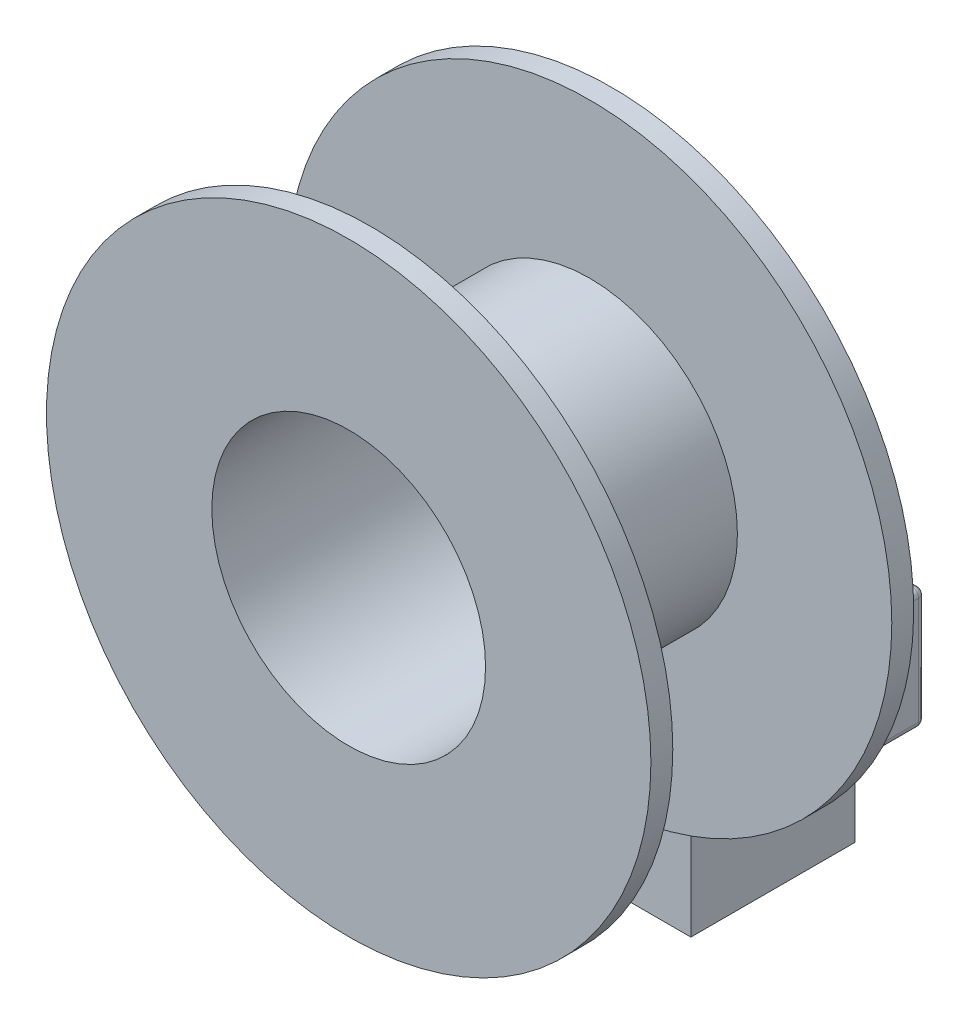
ISO-10303-21;
HEADER;
FILE_DESCRIPTION(('STEP AP214'),'2;1');
FILE_NAME('part.step','',(''),(''),'','','');
FILE_SCHEMA(('AUTOMOTIVE_DESIGN { 1 0 10303 214 1 1 1 1 }'));
ENDSEC;
DATA;
#1=APPLICATION_CONTEXT('core data for automotive mechanical design processes');
#2=APPLICATION_PROTOCOL_DEFINITION('international standard','automotive_design',2000,#1);
#3=PRODUCT_CONTEXT('',#1,'mechanical');
#4=PRODUCT('Part','Part','',(#3));
#5=PRODUCT_RELATED_PRODUCT_CATEGORY('part','',(#4));
#6=PRODUCT_DEFINITION_FORMATION('','',#4);
#7=PRODUCT_DEFINITION_CONTEXT('part definition',#1,'design');
#8=PRODUCT_DEFINITION('design','',#6,#7);
#9=PRODUCT_DEFINITION_SHAPE('','',#8);
#10=(LENGTH_UNIT() NAMED_UNIT(*) SI_UNIT(.MILLI.,.METRE.));
#11=(NAMED_UNIT(*) PLANE_ANGLE_UNIT() SI_UNIT($,.RADIAN.));
#12=(NAMED_UNIT(*) SI_UNIT($,.STERADIAN.) SOLID_ANGLE_UNIT());
#13=UNCERTAINTY_MEASURE_WITH_UNIT(LENGTH_MEASURE(1.E-05),#10,'distance_accuracy_value','');
#14=(GEOMETRIC_REPRESENTATION_CONTEXT(3) GLOBAL_UNCERTAINTY_ASSIGNED_CONTEXT((#13)) GLOBAL_UNIT_ASSIGNED_CONTEXT((#10,
#11,#12)) REPRESENTATION_CONTEXT('',''));
#15=CARTESIAN_POINT('',(0.,0.,0.));
#16=DIRECTION('',(0.,0.,1.));
#17=DIRECTION('',(1.,0.,0.));
#18=AXIS2_PLACEMENT_3D('',#15,#16,#17);
#19=CARTESIAN_POINT('',(0.,0.,1.));
#20=DIRECTION('',(0.,0.,1.));
#21=DIRECTION('',(1.,0.,0.));
#22=AXIS2_PLACEMENT_3D('',#19,#20,#21);
#23=PLANE('',#22);
#24=CARTESIAN_POINT('',(0.,0.,1.));
#25=DIRECTION('',(0.,0.,1.));
#26=DIRECTION('',(1.,0.,0.));
#27=AXIS2_PLACEMENT_3D('',#24,#25,#26);
#28=CIRCLE('',#27,13.8);
#29=CARTESIAN_POINT('',(13.8,0.,1.));
#30=VERTEX_POINT('',#29);
#31=EDGE_CURVE('E200',#30,#30,#28,.T.);
#32=ORIENTED_EDGE('',*,*,#31,.T.);
#33=EDGE_LOOP('',(#32));
#34=FACE_BOUND('',#33,.T.);
#35=CARTESIAN_POINT('',(0.,0.,1.));
#36=DIRECTION('',(0.,0.,1.));
#37=DIRECTION('',(1.,0.,0.));
#38=AXIS2_PLACEMENT_3D('',#35,#36,#37);
#39=CIRCLE('',#38,6.75);
#40=CARTESIAN_POINT('',(6.75,0.,1.));
#41=VERTEX_POINT('',#40);
#42=EDGE_CURVE('E188',#41,#41,#39,.T.);
#43=ORIENTED_EDGE('',*,*,#42,.F.);
#44=EDGE_LOOP('',(#43));
#45=FACE_BOUND('',#44,.T.);
#46=ADVANCED_FACE('F36',(#34,#45),#23,.T.);
#47=CARTESIAN_POINT('',(0.,0.,0.));
#48=DIRECTION('',(0.,0.,1.));
#49=DIRECTION('',(1.,0.,0.));
#50=AXIS2_PLACEMENT_3D('',#47,#48,#49);
#51=PLANE('',#50);
#52=CARTESIAN_POINT('',(0.,0.,0.));
#53=DIRECTION('',(0.,0.,1.));
#54=DIRECTION('',(1.,0.,0.));
#55=AXIS2_PLACEMENT_3D('',#52,#53,#54);
#56=CIRCLE('',#55,13.8);
#57=CARTESIAN_POINT('',(4.125,-13.1690688736904,0.));
#58=VERTEX_POINT('',#57);
#59=CARTESIAN_POINT('',(-4.125,-13.1690688736904,0.));
#60=VERTEX_POINT('',#59);
#61=EDGE_CURVE('E199',#58,#60,#56,.T.);
#62=ORIENTED_EDGE('',*,*,#61,.F.);
#63=DIRECTION('',(0.,1.,0.));
#64=VECTOR('',#63,1.);
#65=CARTESIAN_POINT('',(4.125,0.,0.));
#66=LINE('',#65,#64);
#67=CARTESIAN_POINT('',(4.125,-9.3,0.));
#68=VERTEX_POINT('',#67);
#69=EDGE_CURVE('E178',#58,#68,#66,.T.);
#70=ORIENTED_EDGE('',*,*,#69,.T.);
#71=CARTESIAN_POINT('',(3.825,-9.3,0.));
#72=DIRECTION('',(0.,0.,1.));
#73=DIRECTION('',(1.,0.,0.));
#74=AXIS2_PLACEMENT_3D('',#71,#72,#73);
#75=CIRCLE('',#74,0.3);
#76=CARTESIAN_POINT('',(3.825,-9.,0.));
#77=VERTEX_POINT('',#76);
#78=EDGE_CURVE('E11',#68,#77,#75,.T.);
#79=ORIENTED_EDGE('',*,*,#78,.T.);
#80=DIRECTION('',(-1.,0.,0.));
#81=VECTOR('',#80,1.);
#82=CARTESIAN_POINT('',(0.,-9.,0.));
#83=LINE('',#82,#81);
#84=CARTESIAN_POINT('',(-3.825,-9.,0.));
#85=VERTEX_POINT('',#84);
#86=EDGE_CURVE('E212',#77,#85,#83,.T.);
#87=ORIENTED_EDGE('',*,*,#86,.T.);
#88=CARTESIAN_POINT('',(-3.825,-9.3,0.));
#89=DIRECTION('',(0.,0.,1.));
#90=DIRECTION('',(1.,0.,0.));
#91=AXIS2_PLACEMENT_3D('',#88,#89,#90);
#92=CIRCLE('',#91,0.3);
#93=CARTESIAN_POINT('',(-4.125,-9.3,0.));
#94=VERTEX_POINT('',#93);
#95=EDGE_CURVE('E247',#85,#94,#92,.T.);
#96=ORIENTED_EDGE('',*,*,#95,.T.);
#97=DIRECTION('',(0.,-1.,0.));
#98=VECTOR('',#97,1.);
#99=CARTESIAN_POINT('',(-4.125,0.,0.));
#100=LINE('',#99,#98);
#101=EDGE_CURVE('E175',#94,#60,#100,.T.);
#102=ORIENTED_EDGE('',*,*,#101,.T.);
#103=EDGE_LOOP('',(#62,#70,#79,#87,#96,#102));
#104=FACE_BOUND('',#103,.T.);
#105=CARTESIAN_POINT('',(0.,0.,0.));
#106=DIRECTION('',(0.,0.,1.));
#107=DIRECTION('',(1.,0.,0.));
#108=AXIS2_PLACEMENT_3D('',#105,#106,#107);
#109=CIRCLE('',#108,6.25);
#110=CARTESIAN_POINT('',(6.25,0.,0.));
#111=VERTEX_POINT('',#110);
#112=EDGE_CURVE('E194',#111,#111,#109,.T.);
#113=ORIENTED_EDGE('',*,*,#112,.T.);
#114=EDGE_LOOP('',(#113));
#115=FACE_BOUND('',#114,.T.);
#116=ADVANCED_FACE('F325',(#104,#115),#51,.F.);
#117=CARTESIAN_POINT('',(0.,0.,1.));
#118=DIRECTION('',(0.,0.,-1.));
#119=DIRECTION('',(-1.,0.,0.));
#120=AXIS2_PLACEMENT_3D('',#117,#118,#119);
#121=CYLINDRICAL_SURFACE('',#120,13.8);
#122=ORIENTED_EDGE('',*,*,#31,.F.);
#123=EDGE_LOOP('',(#122));
#124=FACE_BOUND('',#123,.T.);
#125=CARTESIAN_POINT('',(0.,0.,0.5));
#126=DIRECTION('',(0.,0.,-1.));
#127=DIRECTION('',(-1.,0.,0.));
#128=AXIS2_PLACEMENT_3D('',#125,#126,#127);
#129=CIRCLE('',#128,13.8);
#130=CARTESIAN_POINT('',(4.125,-13.1690688736904,0.5));
#131=VERTEX_POINT('',#130);
#132=CARTESIAN_POINT('',(-4.125,-13.1690688736904,0.5));
#133=VERTEX_POINT('',#132);
#134=EDGE_CURVE('E203',#131,#133,#129,.T.);
#135=ORIENTED_EDGE('',*,*,#134,.F.);
#136=DIRECTION('',(0.,0.,-1.));
#137=VECTOR('',#136,1.);
#138=CARTESIAN_POINT('',(4.125,-13.1690688736904,1.));
#139=LINE('',#138,#137);
#140=EDGE_CURVE('E210',#131,#58,#139,.T.);
#141=ORIENTED_EDGE('',*,*,#140,.T.);
#142=ORIENTED_EDGE('',*,*,#61,.T.);
#143=DIRECTION('',(0.,0.,-1.));
#144=VECTOR('',#143,1.);
#145=CARTESIAN_POINT('',(-4.125,-13.1690688736904,1.));
#146=LINE('',#145,#144);
#147=EDGE_CURVE('E208',#60,#133,#146,.F.);
#148=ORIENTED_EDGE('',*,*,#147,.T.);
#149=EDGE_LOOP('',(#135,#141,#142,#148));
#150=FACE_BOUND('',#149,.T.);
#151=ADVANCED_FACE('F354',(#124,#150),#121,.T.);
#152=CARTESIAN_POINT('',(0.,0.,1.));
#153=DIRECTION('',(0.,0.,-1.));
#154=DIRECTION('',(-1.,0.,0.));
#155=AXIS2_PLACEMENT_3D('',#152,#153,#154);
#156=CYLINDRICAL_SURFACE('',#155,6.25);
#157=ORIENTED_EDGE('',*,*,#112,.F.);
#158=EDGE_LOOP('',(#157));
#159=FACE_BOUND('',#158,.T.);
#160=CARTESIAN_POINT('',(0.,0.,12.));
#161=DIRECTION('',(0.,0.,1.));
#162=DIRECTION('',(1.,0.,0.));
#163=AXIS2_PLACEMENT_3D('',#160,#161,#162);
#164=CIRCLE('',#163,6.25);
#165=CARTESIAN_POINT('',(6.25,0.,12.));
#166=VERTEX_POINT('',#165);
#167=EDGE_CURVE('E181',#166,#166,#164,.T.);
#168=ORIENTED_EDGE('',*,*,#167,.T.);
#169=EDGE_LOOP('',(#168));
#170=FACE_BOUND('',#169,.T.);
#171=ADVANCED_FACE('F358',(#159,#170),#156,.F.);
#172=CARTESIAN_POINT('',(0.,0.,11.));
#173=DIRECTION('',(0.,0.,-1.));
#174=DIRECTION('',(-1.,0.,0.));
#175=AXIS2_PLACEMENT_3D('',#172,#173,#174);
#176=CYLINDRICAL_SURFACE('',#175,6.75);
#177=CARTESIAN_POINT('',(0.,0.,11.));
#178=DIRECTION('',(0.,0.,1.));
#179=DIRECTION('',(1.,0.,0.));
#180=AXIS2_PLACEMENT_3D('',#177,#178,#179);
#181=CIRCLE('',#180,6.75);
#182=CARTESIAN_POINT('',(6.75,0.,11.));
#183=VERTEX_POINT('',#182);
#184=EDGE_CURVE('E191',#183,#183,#181,.T.);
#185=ORIENTED_EDGE('',*,*,#184,.F.);
#186=EDGE_LOOP('',(#185));
#187=FACE_BOUND('',#186,.T.);
#188=ORIENTED_EDGE('',*,*,#42,.T.);
#189=EDGE_LOOP('',(#188));
#190=FACE_BOUND('',#189,.T.);
#191=ADVANCED_FACE('F556',(#187,#190),#176,.T.);
#192=CARTESIAN_POINT('',(0.,0.,12.));
#193=DIRECTION('',(0.,0.,1.));
#194=DIRECTION('',(1.,0.,0.));
#195=AXIS2_PLACEMENT_3D('',#192,#193,#194);
#196=PLANE('',#195);
#197=CARTESIAN_POINT('',(0.,0.,12.));
#198=DIRECTION('',(0.,0.,1.));
#199=DIRECTION('',(1.,0.,0.));
#200=AXIS2_PLACEMENT_3D('',#197,#198,#199);
#201=CIRCLE('',#200,13.8);
#202=CARTESIAN_POINT('',(13.8,0.,12.));
#203=VERTEX_POINT('',#202);
#204=EDGE_CURVE('E185',#203,#203,#201,.T.);
#205=ORIENTED_EDGE('',*,*,#204,.T.);
#206=EDGE_LOOP('',(#205));
#207=FACE_BOUND('',#206,.T.);
#208=ORIENTED_EDGE('',*,*,#167,.F.);
#209=EDGE_LOOP('',(#208));
#210=FACE_BOUND('',#209,.T.);
#211=ADVANCED_FACE('F546',(#207,#210),#196,.T.);
#212=CARTESIAN_POINT('',(0.,0.,11.));
#213=DIRECTION('',(0.,0.,1.));
#214=DIRECTION('',(1.,0.,0.));
#215=AXIS2_PLACEMENT_3D('',#212,#213,#214);
#216=PLANE('',#215);
#217=ORIENTED_EDGE('',*,*,#184,.T.);
#218=EDGE_LOOP('',(#217));
#219=FACE_BOUND('',#218,.T.);
#220=CARTESIAN_POINT('',(0.,0.,11.));
#221=DIRECTION('',(0.,0.,1.));
#222=DIRECTION('',(1.,0.,0.));
#223=AXIS2_PLACEMENT_3D('',#220,#221,#222);
#224=CIRCLE('',#223,13.8);
#225=CARTESIAN_POINT('',(13.8,0.,11.));
#226=VERTEX_POINT('',#225);
#227=EDGE_CURVE('E184',#226,#226,#224,.T.);
#228=ORIENTED_EDGE('',*,*,#227,.F.);
#229=EDGE_LOOP('',(#228));
#230=FACE_BOUND('',#229,.T.);
#231=ADVANCED_FACE('F536',(#219,#230),#216,.F.);
#232=CARTESIAN_POINT('',(0.,0.,12.));
#233=DIRECTION('',(0.,0.,-1.));
#234=DIRECTION('',(-1.,0.,0.));
#235=AXIS2_PLACEMENT_3D('',#232,#233,#234);
#236=CYLINDRICAL_SURFACE('',#235,13.8);
#237=ORIENTED_EDGE('',*,*,#204,.F.);
#238=EDGE_LOOP('',(#237));
#239=FACE_BOUND('',#238,.T.);
#240=ORIENTED_EDGE('',*,*,#227,.T.);
#241=EDGE_LOOP('',(#240));
#242=FACE_BOUND('',#241,.T.);
#243=ADVANCED_FACE('F495',(#239,#242),#236,.T.);
#244=CARTESIAN_POINT('',(4.125,-9.,0.5));
#245=DIRECTION('',(0.,1.,0.));
#246=DIRECTION('',(0.,0.,1.));
#247=AXIS2_PLACEMENT_3D('',#244,#245,#246);
#248=PLANE('',#247);
#249=DIRECTION('',(1.,0.,0.));
#250=VECTOR('',#249,1.);
#251=CARTESIAN_POINT('',(4.125,-9.,-9.9));
#252=LINE('',#251,#250);
#253=CARTESIAN_POINT('',(3.825,-9.,-9.9));
#254=VERTEX_POINT('',#253);
#255=CARTESIAN_POINT('',(-3.825,-9.,-9.9));
#256=VERTEX_POINT('',#255);
#257=EDGE_CURVE('E225',#254,#256,#252,.F.);
#258=ORIENTED_EDGE('',*,*,#257,.T.);
#259=DIRECTION('',(0.,0.,-1.));
#260=VECTOR('',#259,1.);
#261=CARTESIAN_POINT('',(-3.825,-9.,0.5));
#262=LINE('',#261,#260);
#263=EDGE_CURVE('E227',#256,#85,#262,.F.);
#264=ORIENTED_EDGE('',*,*,#263,.T.);
#265=ORIENTED_EDGE('',*,*,#86,.F.);
#266=DIRECTION('',(0.,0.,-1.));
#267=VECTOR('',#266,1.);
#268=CARTESIAN_POINT('',(3.825,-9.,0.5));
#269=LINE('',#268,#267);
#270=EDGE_CURVE('E223',#77,#254,#269,.T.);
#271=ORIENTED_EDGE('',*,*,#270,.T.);
#272=EDGE_LOOP('',(#258,#264,#265,#271));
#273=FACE_BOUND('',#272,.T.);
#274=ADVANCED_FACE('F321',(#273),#248,.T.);
#275=CARTESIAN_POINT('',(4.125,-9.,0.5));
#276=DIRECTION('',(1.,0.,0.));
#277=DIRECTION('',(0.,0.,-1.));
#278=AXIS2_PLACEMENT_3D('',#275,#276,#277);
#279=PLANE('',#278);
#280=DIRECTION('',(0.,-1.,0.));
#281=VECTOR('',#280,1.);
#282=CARTESIAN_POINT('',(4.125,-9.,-7.));
#283=LINE('',#282,#281);
#284=CARTESIAN_POINT('',(4.125,-14.2,-7.));
#285=VERTEX_POINT('',#284);
#286=CARTESIAN_POINT('',(4.125,-17.5,-7.));
#287=VERTEX_POINT('',#286);
#288=EDGE_CURVE('E140',#285,#287,#283,.T.);
#289=ORIENTED_EDGE('',*,*,#288,.F.);
#290=DIRECTION('',(0.,0.,1.));
#291=VECTOR('',#290,1.);
#292=CARTESIAN_POINT('',(4.125,-14.2,-10.2));
#293=LINE('',#292,#291);
#294=CARTESIAN_POINT('',(4.125,-14.2,-9.9));
#295=VERTEX_POINT('',#294);
#296=EDGE_CURVE('E239',#285,#295,#293,.F.);
#297=ORIENTED_EDGE('',*,*,#296,.T.);
#298=DIRECTION('',(0.,-1.,0.));
#299=VECTOR('',#298,1.);
#300=CARTESIAN_POINT('',(4.125,-9.,-9.9));
#301=LINE('',#300,#299);
#302=CARTESIAN_POINT('',(4.125,-9.3,-9.9));
#303=VERTEX_POINT('',#302);
#304=EDGE_CURVE('E237',#295,#303,#301,.F.);
#305=ORIENTED_EDGE('',*,*,#304,.T.);
#306=DIRECTION('',(0.,0.,-1.));
#307=VECTOR('',#306,1.);
#308=CARTESIAN_POINT('',(4.125,-9.3,0.5));
#309=LINE('',#308,#307);
#310=EDGE_CURVE('E235',#303,#68,#309,.F.);
#311=ORIENTED_EDGE('',*,*,#310,.T.);
#312=ORIENTED_EDGE('',*,*,#69,.F.);
#313=ORIENTED_EDGE('',*,*,#140,.F.);
#314=DIRECTION('',(0.,-1.,0.));
#315=VECTOR('',#314,1.);
#316=CARTESIAN_POINT('',(4.125,-9.,0.5));
#317=LINE('',#316,#315);
#318=CARTESIAN_POINT('',(4.125,-17.5,0.5));
#319=VERTEX_POINT('',#318);
#320=EDGE_CURVE('E157',#131,#319,#317,.T.);
#321=ORIENTED_EDGE('',*,*,#320,.T.);
#322=DIRECTION('',(0.,0.,-1.));
#323=VECTOR('',#322,1.);
#324=CARTESIAN_POINT('',(4.125,-17.5,0.5));
#325=LINE('',#324,#323);
#326=EDGE_CURVE('E153',#319,#287,#325,.T.);
#327=ORIENTED_EDGE('',*,*,#326,.T.);
#328=EDGE_LOOP('',(#289,#297,#305,#311,#312,#313,#321,#327));
#329=FACE_BOUND('',#328,.T.);
#330=ADVANCED_FACE('F154',(#329),#279,.T.);
#331=CARTESIAN_POINT('',(-4.125,-17.5,0.5));
#332=DIRECTION('',(-1.,0.,0.));
#333=DIRECTION('',(0.,0.,1.));
#334=AXIS2_PLACEMENT_3D('',#331,#332,#333);
#335=PLANE('',#334);
#336=DIRECTION('',(0.,0.,1.));
#337=VECTOR('',#336,1.);
#338=CARTESIAN_POINT('',(-4.125,-14.2,-7.));
#339=LINE('',#338,#337);
#340=CARTESIAN_POINT('',(-4.125,-14.2,-9.9));
#341=VERTEX_POINT('',#340);
#342=CARTESIAN_POINT('',(-4.125,-14.2,-7.));
#343=VERTEX_POINT('',#342);
#344=EDGE_CURVE('E217',#341,#343,#339,.T.);
#345=ORIENTED_EDGE('',*,*,#344,.T.);
#346=DIRECTION('',(0.,1.,0.));
#347=VECTOR('',#346,1.);
#348=CARTESIAN_POINT('',(-4.125,-17.5,-7.));
#349=LINE('',#348,#347);
#350=CARTESIAN_POINT('',(-4.125,-17.5,-7.));
#351=VERTEX_POINT('',#350);
#352=EDGE_CURVE('E165',#351,#343,#349,.T.);
#353=ORIENTED_EDGE('',*,*,#352,.F.);
#354=DIRECTION('',(0.,0.,-1.));
#355=VECTOR('',#354,1.);
#356=CARTESIAN_POINT('',(-4.125,-17.5,0.5));
#357=LINE('',#356,#355);
#358=CARTESIAN_POINT('',(-4.125,-17.5,0.5));
#359=VERTEX_POINT('',#358);
#360=EDGE_CURVE('E161',#359,#351,#357,.T.);
#361=ORIENTED_EDGE('',*,*,#360,.F.);
#362=DIRECTION('',(0.,1.,0.));
#363=VECTOR('',#362,1.);
#364=CARTESIAN_POINT('',(-4.125,-17.5,0.5));
#365=LINE('',#364,#363);
#366=EDGE_CURVE('E162',#359,#133,#365,.T.);
#367=ORIENTED_EDGE('',*,*,#366,.T.);
#368=ORIENTED_EDGE('',*,*,#147,.F.);
#369=ORIENTED_EDGE('',*,*,#101,.F.);
#370=DIRECTION('',(0.,0.,-1.));
#371=VECTOR('',#370,1.);
#372=CARTESIAN_POINT('',(-4.125,-9.3,0.5));
#373=LINE('',#372,#371);
#374=CARTESIAN_POINT('',(-4.125,-9.3,-9.9));
#375=VERTEX_POINT('',#374);
#376=EDGE_CURVE('E220',#94,#375,#373,.T.);
#377=ORIENTED_EDGE('',*,*,#376,.T.);
#378=DIRECTION('',(0.,1.,0.));
#379=VECTOR('',#378,1.);
#380=CARTESIAN_POINT('',(-4.125,-17.5,-9.9));
#381=LINE('',#380,#379);
#382=EDGE_CURVE('E215',#375,#341,#381,.F.);
#383=ORIENTED_EDGE('',*,*,#382,.T.);
#384=EDGE_LOOP('',(#345,#353,#361,#367,#368,#369,#377,#383));
#385=FACE_BOUND('',#384,.T.);
#386=ADVANCED_FACE('F466',(#385),#335,.T.);
#387=CARTESIAN_POINT('',(4.125,-17.5,0.5));
#388=DIRECTION('',(0.,-1.,0.));
#389=DIRECTION('',(0.,0.,-1.));
#390=AXIS2_PLACEMENT_3D('',#387,#388,#389);
#391=PLANE('',#390);
#392=ORIENTED_EDGE('',*,*,#360,.T.);
#393=DIRECTION('',(-1.,0.,0.));
#394=VECTOR('',#393,1.);
#395=CARTESIAN_POINT('',(4.125,-17.5,-7.));
#396=LINE('',#395,#394);
#397=EDGE_CURVE('E145',#287,#351,#396,.T.);
#398=ORIENTED_EDGE('',*,*,#397,.F.);
#399=ORIENTED_EDGE('',*,*,#326,.F.);
#400=DIRECTION('',(-1.,0.,0.));
#401=VECTOR('',#400,1.);
#402=CARTESIAN_POINT('',(4.125,-17.5,0.5));
#403=LINE('',#402,#401);
#404=EDGE_CURVE('E171',#319,#359,#403,.T.);
#405=ORIENTED_EDGE('',*,*,#404,.T.);
#406=EDGE_LOOP('',(#392,#398,#399,#405));
#407=FACE_BOUND('',#406,.T.);
#408=ADVANCED_FACE('F164',(#407),#391,.T.);
#409=CARTESIAN_POINT('',(0.,0.,0.5));
#410=DIRECTION('',(0.,0.,-1.));
#411=DIRECTION('',(-1.,0.,0.));
#412=AXIS2_PLACEMENT_3D('',#409,#410,#411);
#413=PLANE('',#412);
#414=ORIENTED_EDGE('',*,*,#320,.F.);
#415=ORIENTED_EDGE('',*,*,#134,.T.);
#416=ORIENTED_EDGE('',*,*,#366,.F.);
#417=ORIENTED_EDGE('',*,*,#404,.F.);
#418=EDGE_LOOP('',(#414,#415,#416,#417));
#419=FACE_BOUND('',#418,.T.);
#420=ADVANCED_FACE('F506',(#419),#413,.F.);
#421=CARTESIAN_POINT('',(0.,0.,-7.));
#422=DIRECTION('',(0.,0.,-1.));
#423=DIRECTION('',(-1.,0.,0.));
#424=AXIS2_PLACEMENT_3D('',#421,#422,#423);
#425=PLANE('',#424);
#426=DIRECTION('',(-1.,0.,0.));
#427=VECTOR('',#426,1.);
#428=CARTESIAN_POINT('',(4.125,-14.5,-7.));
#429=LINE('',#428,#427);
#430=CARTESIAN_POINT('',(3.825,-14.5,-7.));
#431=VERTEX_POINT('',#430);
#432=CARTESIAN_POINT('',(-3.825,-14.5,-7.));
#433=VERTEX_POINT('',#432);
#434=EDGE_CURVE('E150',#431,#433,#429,.T.);
#435=ORIENTED_EDGE('',*,*,#434,.F.);
#436=CARTESIAN_POINT('',(3.825,-14.2,-7.));
#437=DIRECTION('',(0.,0.,-1.));
#438=DIRECTION('',(-1.,0.,0.));
#439=AXIS2_PLACEMENT_3D('',#436,#437,#438);
#440=CIRCLE('',#439,0.3);
#441=EDGE_CURVE('E45',#431,#285,#440,.F.);
#442=ORIENTED_EDGE('',*,*,#441,.T.);
#443=ORIENTED_EDGE('',*,*,#288,.T.);
#444=ORIENTED_EDGE('',*,*,#397,.T.);
#445=ORIENTED_EDGE('',*,*,#352,.T.);
#446=CARTESIAN_POINT('',(-3.825,-14.2,-7.));
#447=DIRECTION('',(0.,0.,-1.));
#448=DIRECTION('',(-1.,0.,0.));
#449=AXIS2_PLACEMENT_3D('',#446,#447,#448);
#450=CIRCLE('',#449,0.3);
#451=EDGE_CURVE('E249',#343,#433,#450,.F.);
#452=ORIENTED_EDGE('',*,*,#451,.T.);
#453=EDGE_LOOP('',(#435,#442,#443,#444,#445,#452));
#454=FACE_BOUND('',#453,.T.);
#455=ADVANCED_FACE('F143',(#454),#425,.T.);
#456=CARTESIAN_POINT('',(4.125,-14.5,-10.2));
#457=DIRECTION('',(0.,1.,0.));
#458=DIRECTION('',(0.,0.,1.));
#459=AXIS2_PLACEMENT_3D('',#456,#457,#458);
#460=PLANE('',#459);
#461=ORIENTED_EDGE('',*,*,#434,.T.);
#462=DIRECTION('',(0.,0.,1.));
#463=VECTOR('',#462,1.);
#464=CARTESIAN_POINT('',(-3.825,-14.5,-10.2));
#465=LINE('',#464,#463);
#466=CARTESIAN_POINT('',(-3.825,-14.5,-9.9));
#467=VERTEX_POINT('',#466);
#468=EDGE_CURVE('E233',#433,#467,#465,.F.);
#469=ORIENTED_EDGE('',*,*,#468,.T.);
#470=DIRECTION('',(-1.,0.,0.));
#471=VECTOR('',#470,1.);
#472=CARTESIAN_POINT('',(4.125,-14.5,-9.9));
#473=LINE('',#472,#471);
#474=CARTESIAN_POINT('',(3.825,-14.5,-9.9));
#475=VERTEX_POINT('',#474);
#476=EDGE_CURVE('E229',#467,#475,#473,.F.);
#477=ORIENTED_EDGE('',*,*,#476,.T.);
#478=DIRECTION('',(0.,0.,1.));
#479=VECTOR('',#478,1.);
#480=CARTESIAN_POINT('',(3.825,-14.5,-7.));
#481=LINE('',#480,#479);
#482=EDGE_CURVE('E231',#475,#431,#481,.T.);
#483=ORIENTED_EDGE('',*,*,#482,.T.);
#484=EDGE_LOOP('',(#461,#469,#477,#483));
#485=FACE_BOUND('',#484,.T.);
#486=ADVANCED_FACE('F291',(#485),#460,.F.);
#487=CARTESIAN_POINT('',(0.,0.,-10.2));
#488=DIRECTION('',(0.,0.,-1.));
#489=DIRECTION('',(-1.,0.,0.));
#490=AXIS2_PLACEMENT_3D('',#487,#488,#489);
#491=PLANE('',#490);
#492=DIRECTION('',(0.,-1.,0.));
#493=VECTOR('',#492,1.);
#494=CARTESIAN_POINT('',(3.825,0.,-10.2));
#495=LINE('',#494,#493);
#496=CARTESIAN_POINT('',(3.825,-9.3,-10.2));
#497=VERTEX_POINT('',#496);
#498=CARTESIAN_POINT('',(3.825,-14.2,-10.2));
#499=VERTEX_POINT('',#498);
#500=EDGE_CURVE('E53',#497,#499,#495,.T.);
#501=ORIENTED_EDGE('',*,*,#500,.T.);
#502=DIRECTION('',(-1.,0.,0.));
#503=VECTOR('',#502,1.);
#504=CARTESIAN_POINT('',(-4.125,-14.2,-10.2));
#505=LINE('',#504,#503);
#506=CARTESIAN_POINT('',(-3.825,-14.2,-10.2));
#507=VERTEX_POINT('',#506);
#508=EDGE_CURVE('E245',#499,#507,#505,.T.);
#509=ORIENTED_EDGE('',*,*,#508,.T.);
#510=DIRECTION('',(0.,1.,0.));
#511=VECTOR('',#510,1.);
#512=CARTESIAN_POINT('',(-3.825,0.,-10.2));
#513=LINE('',#512,#511);
#514=CARTESIAN_POINT('',(-3.825,-9.3,-10.2));
#515=VERTEX_POINT('',#514);
#516=EDGE_CURVE('E61',#507,#515,#513,.T.);
#517=ORIENTED_EDGE('',*,*,#516,.T.);
#518=DIRECTION('',(1.,0.,0.));
#519=VECTOR('',#518,1.);
#520=CARTESIAN_POINT('',(0.,-9.3,-10.2));
#521=LINE('',#520,#519);
#522=EDGE_CURVE('E241',#515,#497,#521,.T.);
#523=ORIENTED_EDGE('',*,*,#522,.T.);
#524=EDGE_LOOP('',(#501,#509,#517,#523));
#525=FACE_BOUND('',#524,.T.);
#526=ADVANCED_FACE('F302',(#525),#491,.T.);
#527=CARTESIAN_POINT('',(3.825,-14.2,-10.2));
#528=DIRECTION('',(0.,0.,-1.));
#529=DIRECTION('',(-1.,0.,0.));
#530=AXIS2_PLACEMENT_3D('',#527,#528,#529);
#531=CYLINDRICAL_SURFACE('',#530,0.3);
#532=CARTESIAN_POINT('',(3.825,-14.2,-9.9));
#533=DIRECTION('',(0.,0.,-1.));
#534=DIRECTION('',(-1.,0.,0.));
#535=AXIS2_PLACEMENT_3D('',#532,#533,#534);
#536=CIRCLE('',#535,0.3);
#537=EDGE_CURVE('E40',#295,#475,#536,.T.);
#538=ORIENTED_EDGE('',*,*,#537,.F.);
#539=ORIENTED_EDGE('',*,*,#296,.F.);
#540=ORIENTED_EDGE('',*,*,#441,.F.);
#541=ORIENTED_EDGE('',*,*,#482,.F.);
#542=EDGE_LOOP('',(#538,#539,#540,#541));
#543=FACE_BOUND('',#542,.T.);
#544=ADVANCED_FACE('F38',(#543),#531,.T.);
#545=CARTESIAN_POINT('',(3.825,-14.2,-9.9));
#546=DIRECTION('',(0.,0.,1.));
#547=DIRECTION('',(1.,0.,0.));
#548=AXIS2_PLACEMENT_3D('',#545,#546,#547);
#549=SPHERICAL_SURFACE('',#548,0.3);
#550=CARTESIAN_POINT('',(3.825,-14.2,-9.9));
#551=DIRECTION('',(0.,-1.,0.));
#552=DIRECTION('',(0.,0.,-1.));
#553=AXIS2_PLACEMENT_3D('',#550,#551,#552);
#554=CIRCLE('',#553,0.3);
#555=EDGE_CURVE('E277',#295,#499,#554,.F.);
#556=ORIENTED_EDGE('',*,*,#555,.F.);
#557=ORIENTED_EDGE('',*,*,#537,.T.);
#558=CARTESIAN_POINT('',(3.825,-14.2,-9.9));
#559=DIRECTION('',(1.,0.,0.));
#560=DIRECTION('',(0.,0.,-1.));
#561=AXIS2_PLACEMENT_3D('',#558,#559,#560);
#562=CIRCLE('',#561,0.3);
#563=EDGE_CURVE('E278',#499,#475,#562,.F.);
#564=ORIENTED_EDGE('',*,*,#563,.F.);
#565=EDGE_LOOP('',(#556,#557,#564));
#566=FACE_BOUND('',#565,.T.);
#567=ADVANCED_FACE('F340',(#566),#549,.T.);
#568=CARTESIAN_POINT('',(-3.825,-14.2,0.5));
#569=DIRECTION('',(0.,0.,-1.));
#570=DIRECTION('',(-1.,0.,0.));
#571=AXIS2_PLACEMENT_3D('',#568,#569,#570);
#572=CYLINDRICAL_SURFACE('',#571,0.3);
#573=ORIENTED_EDGE('',*,*,#451,.F.);
#574=ORIENTED_EDGE('',*,*,#344,.F.);
#575=CARTESIAN_POINT('',(-3.825,-14.2,-9.9));
#576=DIRECTION('',(0.,0.,-1.));
#577=DIRECTION('',(-1.,0.,0.));
#578=AXIS2_PLACEMENT_3D('',#575,#576,#577);
#579=CIRCLE('',#578,0.3);
#580=EDGE_CURVE('E274',#467,#341,#579,.T.);
#581=ORIENTED_EDGE('',*,*,#580,.F.);
#582=ORIENTED_EDGE('',*,*,#468,.F.);
#583=EDGE_LOOP('',(#573,#574,#581,#582));
#584=FACE_BOUND('',#583,.T.);
#585=ADVANCED_FACE('F296',(#584),#572,.T.);
#586=CARTESIAN_POINT('',(0.,-14.2,-9.9));
#587=DIRECTION('',(1.,0.,0.));
#588=DIRECTION('',(0.,0.,-1.));
#589=AXIS2_PLACEMENT_3D('',#586,#587,#588);
#590=CYLINDRICAL_SURFACE('',#589,0.3);
#591=ORIENTED_EDGE('',*,*,#563,.T.);
#592=ORIENTED_EDGE('',*,*,#476,.F.);
#593=CARTESIAN_POINT('',(-3.825,-14.2,-9.9));
#594=DIRECTION('',(-1.,0.,0.));
#595=DIRECTION('',(0.,0.,1.));
#596=AXIS2_PLACEMENT_3D('',#593,#594,#595);
#597=CIRCLE('',#596,0.3);
#598=EDGE_CURVE('E271',#507,#467,#597,.T.);
#599=ORIENTED_EDGE('',*,*,#598,.F.);
#600=ORIENTED_EDGE('',*,*,#508,.F.);
#601=EDGE_LOOP('',(#591,#592,#599,#600));
#602=FACE_BOUND('',#601,.T.);
#603=ADVANCED_FACE('F301',(#602),#590,.T.);
#604=CARTESIAN_POINT('',(3.825,0.,-9.9));
#605=DIRECTION('',(0.,-1.,0.));
#606=DIRECTION('',(0.,0.,-1.));
#607=AXIS2_PLACEMENT_3D('',#604,#605,#606);
#608=CYLINDRICAL_SURFACE('',#607,0.3);
#609=ORIENTED_EDGE('',*,*,#555,.T.);
#610=ORIENTED_EDGE('',*,*,#500,.F.);
#611=CARTESIAN_POINT('',(3.825,-9.3,-9.9));
#612=DIRECTION('',(0.,1.,0.));
#613=DIRECTION('',(0.,0.,1.));
#614=AXIS2_PLACEMENT_3D('',#611,#612,#613);
#615=CIRCLE('',#614,0.3);
#616=EDGE_CURVE('E268',#303,#497,#615,.T.);
#617=ORIENTED_EDGE('',*,*,#616,.F.);
#618=ORIENTED_EDGE('',*,*,#304,.F.);
#619=EDGE_LOOP('',(#609,#610,#617,#618));
#620=FACE_BOUND('',#619,.T.);
#621=ADVANCED_FACE('F339',(#620),#608,.T.);
#622=CARTESIAN_POINT('',(3.825,-9.3,0.5));
#623=DIRECTION('',(0.,0.,-1.));
#624=DIRECTION('',(-1.,0.,0.));
#625=AXIS2_PLACEMENT_3D('',#622,#623,#624);
#626=CYLINDRICAL_SURFACE('',#625,0.3);
#627=ORIENTED_EDGE('',*,*,#78,.F.);
#628=ORIENTED_EDGE('',*,*,#310,.F.);
#629=CARTESIAN_POINT('',(3.825,-9.3,-9.9));
#630=DIRECTION('',(0.,0.,-1.));
#631=DIRECTION('',(-1.,0.,0.));
#632=AXIS2_PLACEMENT_3D('',#629,#630,#631);
#633=CIRCLE('',#632,0.3);
#634=EDGE_CURVE('E265',#254,#303,#633,.T.);
#635=ORIENTED_EDGE('',*,*,#634,.F.);
#636=ORIENTED_EDGE('',*,*,#270,.F.);
#637=EDGE_LOOP('',(#627,#628,#635,#636));
#638=FACE_BOUND('',#637,.T.);
#639=ADVANCED_FACE('F332',(#638),#626,.T.);
#640=CARTESIAN_POINT('',(-3.825,-14.2,-9.9));
#641=DIRECTION('',(0.,0.,1.));
#642=DIRECTION('',(1.,0.,0.));
#643=AXIS2_PLACEMENT_3D('',#640,#641,#642);
#644=SPHERICAL_SURFACE('',#643,0.3);
#645=ORIENTED_EDGE('',*,*,#598,.T.);
#646=ORIENTED_EDGE('',*,*,#580,.T.);
#647=CARTESIAN_POINT('',(-3.825,-14.2,-9.9));
#648=DIRECTION('',(0.,-1.,0.));
#649=DIRECTION('',(0.,0.,-1.));
#650=AXIS2_PLACEMENT_3D('',#647,#648,#649);
#651=CIRCLE('',#650,0.3);
#652=EDGE_CURVE('E263',#507,#341,#651,.F.);
#653=ORIENTED_EDGE('',*,*,#652,.F.);
#654=EDGE_LOOP('',(#645,#646,#653));
#655=FACE_BOUND('',#654,.T.);
#656=ADVANCED_FACE('F300',(#655),#644,.T.);
#657=CARTESIAN_POINT('',(3.825,-9.3,-9.9));
#658=DIRECTION('',(0.,0.,1.));
#659=DIRECTION('',(1.,0.,0.));
#660=AXIS2_PLACEMENT_3D('',#657,#658,#659);
#661=SPHERICAL_SURFACE('',#660,0.3);
#662=ORIENTED_EDGE('',*,*,#634,.T.);
#663=ORIENTED_EDGE('',*,*,#616,.T.);
#664=CARTESIAN_POINT('',(3.825,-9.3,-9.9));
#665=DIRECTION('',(1.,0.,0.));
#666=DIRECTION('',(0.,0.,-1.));
#667=AXIS2_PLACEMENT_3D('',#664,#665,#666);
#668=CIRCLE('',#667,0.3);
#669=EDGE_CURVE('E260',#254,#497,#668,.F.);
#670=ORIENTED_EDGE('',*,*,#669,.F.);
#671=EDGE_LOOP('',(#662,#663,#670));
#672=FACE_BOUND('',#671,.T.);
#673=ADVANCED_FACE('F336',(#672),#661,.T.);
#674=CARTESIAN_POINT('',(-3.825,0.,-9.9));
#675=DIRECTION('',(0.,1.,0.));
#676=DIRECTION('',(0.,0.,1.));
#677=AXIS2_PLACEMENT_3D('',#674,#675,#676);
#678=CYLINDRICAL_SURFACE('',#677,0.3);
#679=ORIENTED_EDGE('',*,*,#652,.T.);
#680=ORIENTED_EDGE('',*,*,#382,.F.);
#681=CARTESIAN_POINT('',(-3.825,-9.3,-9.9));
#682=DIRECTION('',(0.,1.,0.));
#683=DIRECTION('',(0.,0.,1.));
#684=AXIS2_PLACEMENT_3D('',#681,#682,#683);
#685=CIRCLE('',#684,0.3);
#686=EDGE_CURVE('E257',#515,#375,#685,.T.);
#687=ORIENTED_EDGE('',*,*,#686,.F.);
#688=ORIENTED_EDGE('',*,*,#516,.F.);
#689=EDGE_LOOP('',(#679,#680,#687,#688));
#690=FACE_BOUND('',#689,.T.);
#691=ADVANCED_FACE('F311',(#690),#678,.T.);
#692=CARTESIAN_POINT('',(0.,-9.3,-9.9));
#693=DIRECTION('',(1.,0.,0.));
#694=DIRECTION('',(0.,0.,-1.));
#695=AXIS2_PLACEMENT_3D('',#692,#693,#694);
#696=CYLINDRICAL_SURFACE('',#695,0.3);
#697=ORIENTED_EDGE('',*,*,#669,.T.);
#698=ORIENTED_EDGE('',*,*,#522,.F.);
#699=CARTESIAN_POINT('',(-3.825,-9.3,-9.9));
#700=DIRECTION('',(-1.,0.,0.));
#701=DIRECTION('',(0.,0.,1.));
#702=AXIS2_PLACEMENT_3D('',#699,#700,#701);
#703=CIRCLE('',#702,0.3);
#704=EDGE_CURVE('E254',#256,#515,#703,.T.);
#705=ORIENTED_EDGE('',*,*,#704,.F.);
#706=ORIENTED_EDGE('',*,*,#257,.F.);
#707=EDGE_LOOP('',(#697,#698,#705,#706));
#708=FACE_BOUND('',#707,.T.);
#709=ADVANCED_FACE('F306',(#708),#696,.T.);
#710=CARTESIAN_POINT('',(-3.825,-9.3,-9.9));
#711=DIRECTION('',(0.,0.,1.));
#712=DIRECTION('',(1.,0.,0.));
#713=AXIS2_PLACEMENT_3D('',#710,#711,#712);
#714=SPHERICAL_SURFACE('',#713,0.3);
#715=ORIENTED_EDGE('',*,*,#704,.T.);
#716=ORIENTED_EDGE('',*,*,#686,.T.);
#717=CARTESIAN_POINT('',(-3.825,-9.3,-9.9));
#718=DIRECTION('',(0.,0.,-1.));
#719=DIRECTION('',(-1.,0.,0.));
#720=AXIS2_PLACEMENT_3D('',#717,#718,#719);
#721=CIRCLE('',#720,0.3);
#722=EDGE_CURVE('E252',#256,#375,#721,.F.);
#723=ORIENTED_EDGE('',*,*,#722,.F.);
#724=EDGE_LOOP('',(#715,#716,#723));
#725=FACE_BOUND('',#724,.T.);
#726=ADVANCED_FACE('F314',(#725),#714,.T.);
#727=CARTESIAN_POINT('',(-3.825,-9.3,0.5));
#728=DIRECTION('',(0.,0.,-1.));
#729=DIRECTION('',(-1.,0.,0.));
#730=AXIS2_PLACEMENT_3D('',#727,#728,#729);
#731=CYLINDRICAL_SURFACE('',#730,0.3);
#732=ORIENTED_EDGE('',*,*,#95,.F.);
#733=ORIENTED_EDGE('',*,*,#263,.F.);
#734=ORIENTED_EDGE('',*,*,#722,.T.);
#735=ORIENTED_EDGE('',*,*,#376,.F.);
#736=EDGE_LOOP('',(#732,#733,#734,#735));
#737=FACE_BOUND('',#736,.T.);
#738=ADVANCED_FACE('F318',(#737),#731,.T.);
#739=CLOSED_SHELL('',(#46,#116,#151,#171,#191,#211,#231,#243,#274,#330,#386,#408,#420,#455,#486,
#526,#544,#567,#585,#603,#621,#639,#656,#673,#691,#709,#726,#738));
#740=MANIFOLD_SOLID_BREP('B2',#739);
#741=ADVANCED_BREP_SHAPE_REPRESENTATION('',(#18,#740),#14);
#742=SHAPE_DEFINITION_REPRESENTATION(#9,#741);
ENDSEC;
END-ISO-10303-21;
